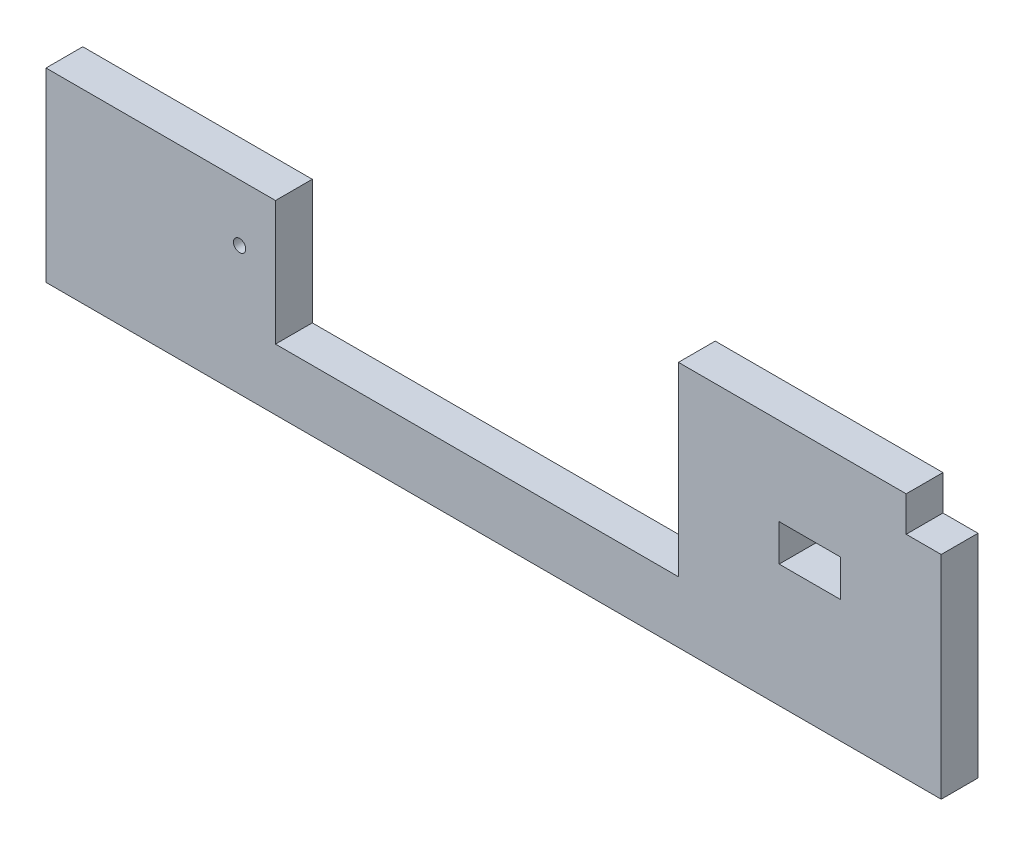
ISO-10303-21;
HEADER;
FILE_DESCRIPTION(('STEP AP214'),'2;1');
FILE_NAME('part.step','',(''),(''),'','','');
FILE_SCHEMA(('AUTOMOTIVE_DESIGN { 1 0 10303 214 1 1 1 1 }'));
ENDSEC;
DATA;
#1=APPLICATION_CONTEXT('core data for automotive mechanical design processes');
#2=APPLICATION_PROTOCOL_DEFINITION('international standard','automotive_design',2000,#1);
#3=PRODUCT_CONTEXT('',#1,'mechanical');
#4=PRODUCT('Part','Part','',(#3));
#5=PRODUCT_RELATED_PRODUCT_CATEGORY('part','',(#4));
#6=PRODUCT_DEFINITION_FORMATION('','',#4);
#7=PRODUCT_DEFINITION_CONTEXT('part definition',#1,'design');
#8=PRODUCT_DEFINITION('design','',#6,#7);
#9=PRODUCT_DEFINITION_SHAPE('','',#8);
#10=(LENGTH_UNIT() NAMED_UNIT(*) SI_UNIT(.MILLI.,.METRE.));
#11=(NAMED_UNIT(*) PLANE_ANGLE_UNIT() SI_UNIT($,.RADIAN.));
#12=(NAMED_UNIT(*) SI_UNIT($,.STERADIAN.) SOLID_ANGLE_UNIT());
#13=UNCERTAINTY_MEASURE_WITH_UNIT(LENGTH_MEASURE(1.E-05),#10,'distance_accuracy_value','');
#14=(GEOMETRIC_REPRESENTATION_CONTEXT(3) GLOBAL_UNCERTAINTY_ASSIGNED_CONTEXT((#13)) GLOBAL_UNIT_ASSIGNED_CONTEXT((#10,
#11,#12)) REPRESENTATION_CONTEXT('',''));
#15=CARTESIAN_POINT('',(0.,0.,0.));
#16=DIRECTION('',(0.,0.,1.));
#17=DIRECTION('',(1.,0.,0.));
#18=AXIS2_PLACEMENT_3D('',#15,#16,#17);
#19=CARTESIAN_POINT('',(-85.0624454176962,-35.0708196621493,5.334));
#20=DIRECTION('',(0.,-1.,0.));
#21=DIRECTION('',(0.,0.,-1.));
#22=AXIS2_PLACEMENT_3D('',#19,#20,#21);
#23=PLANE('',#22);
#24=DIRECTION('',(-1.,0.,0.));
#25=VECTOR('',#24,1.);
#26=CARTESIAN_POINT('',(-85.0624454176962,-35.0708196621493,5.334));
#27=LINE('',#26,#25);
#28=CARTESIAN_POINT('',(-51.7884454176962,-35.0708196621493,5.334));
#29=VERTEX_POINT('',#28);
#30=CARTESIAN_POINT('',(-85.0624454176962,-35.0708196621493,5.334));
#31=VERTEX_POINT('',#30);
#32=EDGE_CURVE('E45',#29,#31,#27,.T.);
#33=ORIENTED_EDGE('',*,*,#32,.F.);
#34=DIRECTION('',(0.,0.,1.));
#35=VECTOR('',#34,1.);
#36=CARTESIAN_POINT('',(-51.7884454176962,-35.0708196621493,0.));
#37=LINE('',#36,#35);
#38=CARTESIAN_POINT('',(-51.7884454176962,-35.0708196621493,0.));
#39=VERTEX_POINT('',#38);
#40=EDGE_CURVE('E147',#39,#29,#37,.T.);
#41=ORIENTED_EDGE('',*,*,#40,.F.);
#42=DIRECTION('',(-1.,0.,0.));
#43=VECTOR('',#42,1.);
#44=CARTESIAN_POINT('',(-85.0624454176962,-35.0708196621493,0.));
#45=LINE('',#44,#43);
#46=CARTESIAN_POINT('',(-85.0624454176962,-35.0708196621493,0.));
#47=VERTEX_POINT('',#46);
#48=EDGE_CURVE('E251',#39,#47,#45,.T.);
#49=ORIENTED_EDGE('',*,*,#48,.T.);
#50=DIRECTION('',(0.,0.,-1.));
#51=VECTOR('',#50,1.);
#52=CARTESIAN_POINT('',(-85.0624454176962,-35.0708196621493,5.334));
#53=LINE('',#52,#51);
#54=EDGE_CURVE('E11',#31,#47,#53,.T.);
#55=ORIENTED_EDGE('',*,*,#54,.F.);
#56=EDGE_LOOP('',(#33,#41,#49,#55));
#57=FACE_BOUND('',#56,.T.);
#58=ADVANCED_FACE('F37',(#57),#23,.F.);
#59=CARTESIAN_POINT('',(-85.0624454176962,-35.0708196621493,5.334));
#60=DIRECTION('',(1.,0.,0.));
#61=DIRECTION('',(0.,1.,0.));
#62=AXIS2_PLACEMENT_3D('',#59,#60,#61);
#63=PLANE('',#62);
#64=DIRECTION('',(0.,-1.,0.));
#65=VECTOR('',#64,1.);
#66=CARTESIAN_POINT('',(-85.0624454176962,-35.0708196621493,0.));
#67=LINE('',#66,#65);
#68=CARTESIAN_POINT('',(-85.0624454176962,-61.9948196621493,0.));
#69=VERTEX_POINT('',#68);
#70=EDGE_CURVE('E138',#47,#69,#67,.T.);
#71=ORIENTED_EDGE('',*,*,#70,.T.);
#72=DIRECTION('',(0.,0.,-1.));
#73=VECTOR('',#72,1.);
#74=CARTESIAN_POINT('',(-85.0624454176962,-61.9948196621493,5.334));
#75=LINE('',#74,#73);
#76=CARTESIAN_POINT('',(-85.0624454176962,-61.9948196621493,5.334));
#77=VERTEX_POINT('',#76);
#78=EDGE_CURVE('E142',#77,#69,#75,.T.);
#79=ORIENTED_EDGE('',*,*,#78,.F.);
#80=DIRECTION('',(0.,-1.,0.));
#81=VECTOR('',#80,1.);
#82=CARTESIAN_POINT('',(-85.0624454176962,-35.0708196621493,5.334));
#83=LINE('',#82,#81);
#84=EDGE_CURVE('E248',#31,#77,#83,.T.);
#85=ORIENTED_EDGE('',*,*,#84,.F.);
#86=ORIENTED_EDGE('',*,*,#54,.T.);
#87=EDGE_LOOP('',(#71,#79,#85,#86));
#88=FACE_BOUND('',#87,.T.);
#89=ADVANCED_FACE('F39',(#88),#63,.F.);
#90=CARTESIAN_POINT('',(44.7315545823038,-35.0708196621493,5.334));
#91=DIRECTION('',(-1.,0.,0.));
#92=DIRECTION('',(0.,-1.,0.));
#93=AXIS2_PLACEMENT_3D('',#90,#91,#92);
#94=PLANE('',#93);
#95=DIRECTION('',(0.,1.,0.));
#96=VECTOR('',#95,1.);
#97=CARTESIAN_POINT('',(44.7315545823038,-35.0708196621493,0.));
#98=LINE('',#97,#96);
#99=CARTESIAN_POINT('',(44.7315545823038,-61.9948196621493,0.));
#100=VERTEX_POINT('',#99);
#101=CARTESIAN_POINT('',(44.7315545823038,-31.2608196621493,0.));
#102=VERTEX_POINT('',#101);
#103=EDGE_CURVE('E146',#100,#102,#98,.T.);
#104=ORIENTED_EDGE('',*,*,#103,.T.);
#105=DIRECTION('',(0.,0.,1.));
#106=VECTOR('',#105,1.);
#107=CARTESIAN_POINT('',(44.7315545823038,-31.2608196621493,0.));
#108=LINE('',#107,#106);
#109=CARTESIAN_POINT('',(44.7315545823038,-31.2608196621493,5.334));
#110=VERTEX_POINT('',#109);
#111=EDGE_CURVE('E212',#102,#110,#108,.T.);
#112=ORIENTED_EDGE('',*,*,#111,.T.);
#113=DIRECTION('',(0.,1.,0.));
#114=VECTOR('',#113,1.);
#115=CARTESIAN_POINT('',(44.7315545823038,-35.0708196621493,5.334));
#116=LINE('',#115,#114);
#117=CARTESIAN_POINT('',(44.7315545823038,-61.9948196621493,5.334));
#118=VERTEX_POINT('',#117);
#119=EDGE_CURVE('E250',#118,#110,#116,.T.);
#120=ORIENTED_EDGE('',*,*,#119,.F.);
#121=DIRECTION('',(0.,0.,1.));
#122=VECTOR('',#121,1.);
#123=CARTESIAN_POINT('',(44.7315545823038,-61.9948196621493,5.334));
#124=LINE('',#123,#122);
#125=EDGE_CURVE('E158',#100,#118,#124,.T.);
#126=ORIENTED_EDGE('',*,*,#125,.F.);
#127=EDGE_LOOP('',(#104,#112,#120,#126));
#128=FACE_BOUND('',#127,.T.);
#129=ADVANCED_FACE('F285',(#128),#94,.F.);
#130=CARTESIAN_POINT('',(0.,0.,5.334));
#131=DIRECTION('',(0.,0.,1.));
#132=DIRECTION('',(1.,0.,0.));
#133=AXIS2_PLACEMENT_3D('',#130,#131,#132);
#134=PLANE('',#133);
#135=CARTESIAN_POINT('',(-56.9954454176962,-43.3258196621493,5.334));
#136=DIRECTION('',(0.,0.,1.));
#137=DIRECTION('',(1.,0.,0.));
#138=AXIS2_PLACEMENT_3D('',#135,#136,#137);
#139=CIRCLE('',#138,0.889000000000002);
#140=CARTESIAN_POINT('',(-56.1064454176962,-43.3258196621493,5.334));
#141=VERTEX_POINT('',#140);
#142=EDGE_CURVE('E168',#141,#141,#139,.T.);
#143=ORIENTED_EDGE('',*,*,#142,.F.);
#144=EDGE_LOOP('',(#143));
#145=FACE_BOUND('',#144,.T.);
#146=DIRECTION('',(0.,-1.,0.));
#147=VECTOR('',#146,1.);
#148=CARTESIAN_POINT('',(21.2365545823038,-38.8808196621493,5.334));
#149=LINE('',#148,#147);
#150=CARTESIAN_POINT('',(21.2365545823038,-38.8808196621493,5.334));
#151=VERTEX_POINT('',#150);
#152=CARTESIAN_POINT('',(21.2365545823038,-44.2148196621493,5.334));
#153=VERTEX_POINT('',#152);
#154=EDGE_CURVE('E52',#151,#153,#149,.T.);
#155=ORIENTED_EDGE('',*,*,#154,.F.);
#156=DIRECTION('',(-1.,0.,0.));
#157=VECTOR('',#156,1.);
#158=CARTESIAN_POINT('',(21.2365545823038,-38.8808196621493,5.334));
#159=LINE('',#158,#157);
#160=CARTESIAN_POINT('',(30.1265545823038,-38.8808196621493,5.334));
#161=VERTEX_POINT('',#160);
#162=EDGE_CURVE('E178',#161,#151,#159,.T.);
#163=ORIENTED_EDGE('',*,*,#162,.F.);
#164=DIRECTION('',(0.,1.,0.));
#165=VECTOR('',#164,1.);
#166=CARTESIAN_POINT('',(30.1265545823038,-38.8808196621493,5.334));
#167=LINE('',#166,#165);
#168=CARTESIAN_POINT('',(30.1265545823038,-44.2148196621493,5.334));
#169=VERTEX_POINT('',#168);
#170=EDGE_CURVE('E190',#169,#161,#167,.T.);
#171=ORIENTED_EDGE('',*,*,#170,.F.);
#172=DIRECTION('',(1.,0.,0.));
#173=VECTOR('',#172,1.);
#174=CARTESIAN_POINT('',(21.2365545823038,-44.2148196621493,5.334));
#175=LINE('',#174,#173);
#176=EDGE_CURVE('E187',#153,#169,#175,.T.);
#177=ORIENTED_EDGE('',*,*,#176,.F.);
#178=EDGE_LOOP('',(#155,#163,#171,#177));
#179=FACE_BOUND('',#178,.T.);
#180=DIRECTION('',(1.,0.,0.));
#181=VECTOR('',#180,1.);
#182=CARTESIAN_POINT('',(44.7315545823038,-31.2608196621493,5.334));
#183=LINE('',#182,#181);
#184=CARTESIAN_POINT('',(39.6515545823038,-31.2608196621493,5.334));
#185=VERTEX_POINT('',#184);
#186=EDGE_CURVE('E206',#185,#110,#183,.T.);
#187=ORIENTED_EDGE('',*,*,#186,.F.);
#188=DIRECTION('',(0.,-1.,0.));
#189=VECTOR('',#188,1.);
#190=CARTESIAN_POINT('',(39.6515545823038,-26.1808196621493,5.334));
#191=LINE('',#190,#189);
#192=CARTESIAN_POINT('',(39.6515545823038,-26.1808196621493,5.334));
#193=VERTEX_POINT('',#192);
#194=EDGE_CURVE('E197',#193,#185,#191,.T.);
#195=ORIENTED_EDGE('',*,*,#194,.F.);
#196=DIRECTION('',(1.,0.,0.));
#197=VECTOR('',#196,1.);
#198=CARTESIAN_POINT('',(6.63155458230381,-26.1808196621493,5.334));
#199=LINE('',#198,#197);
#200=CARTESIAN_POINT('',(6.63155458230381,-26.1808196621493,5.334));
#201=VERTEX_POINT('',#200);
#202=EDGE_CURVE('E221',#201,#193,#199,.T.);
#203=ORIENTED_EDGE('',*,*,#202,.F.);
#204=DIRECTION('',(0.,1.,0.));
#205=VECTOR('',#204,1.);
#206=CARTESIAN_POINT('',(6.63155458230381,-35.0708196621493,5.334));
#207=LINE('',#206,#205);
#208=CARTESIAN_POINT('',(6.63155458230381,-53.1048196621493,5.334));
#209=VERTEX_POINT('',#208);
#210=EDGE_CURVE('E231',#209,#201,#207,.T.);
#211=ORIENTED_EDGE('',*,*,#210,.F.);
#212=DIRECTION('',(1.,0.,0.));
#213=VECTOR('',#212,1.);
#214=CARTESIAN_POINT('',(-51.7884454176962,-53.1048196621493,5.334));
#215=LINE('',#214,#213);
#216=CARTESIAN_POINT('',(-51.7884454176962,-53.1048196621493,5.334));
#217=VERTEX_POINT('',#216);
#218=EDGE_CURVE('E240',#217,#209,#215,.T.);
#219=ORIENTED_EDGE('',*,*,#218,.F.);
#220=DIRECTION('',(0.,-1.,0.));
#221=VECTOR('',#220,1.);
#222=CARTESIAN_POINT('',(-51.7884454176962,-35.0708196621493,5.334));
#223=LINE('',#222,#221);
#224=EDGE_CURVE('E226',#29,#217,#223,.T.);
#225=ORIENTED_EDGE('',*,*,#224,.F.);
#226=ORIENTED_EDGE('',*,*,#32,.T.);
#227=ORIENTED_EDGE('',*,*,#84,.T.);
#228=DIRECTION('',(-1.,0.,0.));
#229=VECTOR('',#228,1.);
#230=CARTESIAN_POINT('',(-85.0624454176962,-61.9948196621493,5.334));
#231=LINE('',#230,#229);
#232=EDGE_CURVE('E163',#118,#77,#231,.T.);
#233=ORIENTED_EDGE('',*,*,#232,.F.);
#234=ORIENTED_EDGE('',*,*,#119,.T.);
#235=EDGE_LOOP('',(#187,#195,#203,#211,#219,#225,#226,#227,#233,#234));
#236=FACE_BOUND('',#235,.T.);
#237=ADVANCED_FACE('F280',(#145,#179,#236),#134,.T.);
#238=CARTESIAN_POINT('',(0.,0.,0.));
#239=DIRECTION('',(0.,0.,1.));
#240=DIRECTION('',(1.,0.,0.));
#241=AXIS2_PLACEMENT_3D('',#238,#239,#240);
#242=PLANE('',#241);
#243=CARTESIAN_POINT('',(-56.9954454176962,-43.3258196621493,0.));
#244=DIRECTION('',(0.,0.,1.));
#245=DIRECTION('',(1.,0.,0.));
#246=AXIS2_PLACEMENT_3D('',#243,#244,#245);
#247=CIRCLE('',#246,0.889000000000002);
#248=CARTESIAN_POINT('',(-56.1064454176962,-43.3258196621493,0.));
#249=VERTEX_POINT('',#248);
#250=EDGE_CURVE('E169',#249,#249,#247,.T.);
#251=ORIENTED_EDGE('',*,*,#250,.T.);
#252=EDGE_LOOP('',(#251));
#253=FACE_BOUND('',#252,.T.);
#254=DIRECTION('',(-1.,0.,0.));
#255=VECTOR('',#254,1.);
#256=CARTESIAN_POINT('',(21.2365545823038,-38.8808196621493,0.));
#257=LINE('',#256,#255);
#258=CARTESIAN_POINT('',(30.1265545823038,-38.8808196621493,0.));
#259=VERTEX_POINT('',#258);
#260=CARTESIAN_POINT('',(21.2365545823038,-38.8808196621493,0.));
#261=VERTEX_POINT('',#260);
#262=EDGE_CURVE('E182',#259,#261,#257,.T.);
#263=ORIENTED_EDGE('',*,*,#262,.T.);
#264=DIRECTION('',(0.,-1.,0.));
#265=VECTOR('',#264,1.);
#266=CARTESIAN_POINT('',(21.2365545823038,-38.8808196621493,0.));
#267=LINE('',#266,#265);
#268=CARTESIAN_POINT('',(21.2365545823038,-44.2148196621493,0.));
#269=VERTEX_POINT('',#268);
#270=EDGE_CURVE('E174',#261,#269,#267,.T.);
#271=ORIENTED_EDGE('',*,*,#270,.T.);
#272=DIRECTION('',(1.,0.,0.));
#273=VECTOR('',#272,1.);
#274=CARTESIAN_POINT('',(21.2365545823038,-44.2148196621493,0.));
#275=LINE('',#274,#273);
#276=CARTESIAN_POINT('',(30.1265545823038,-44.2148196621493,0.));
#277=VERTEX_POINT('',#276);
#278=EDGE_CURVE('E177',#269,#277,#275,.T.);
#279=ORIENTED_EDGE('',*,*,#278,.T.);
#280=DIRECTION('',(0.,1.,0.));
#281=VECTOR('',#280,1.);
#282=CARTESIAN_POINT('',(30.1265545823038,-38.8808196621493,0.));
#283=LINE('',#282,#281);
#284=EDGE_CURVE('E60',#277,#259,#283,.T.);
#285=ORIENTED_EDGE('',*,*,#284,.T.);
#286=EDGE_LOOP('',(#263,#271,#279,#285));
#287=FACE_BOUND('',#286,.T.);
#288=DIRECTION('',(0.,-1.,0.));
#289=VECTOR('',#288,1.);
#290=CARTESIAN_POINT('',(39.6515545823038,-26.1808196621493,0.));
#291=LINE('',#290,#289);
#292=CARTESIAN_POINT('',(39.6515545823038,-26.1808196621493,0.));
#293=VERTEX_POINT('',#292);
#294=CARTESIAN_POINT('',(39.6515545823038,-31.2608196621493,0.));
#295=VERTEX_POINT('',#294);
#296=EDGE_CURVE('E203',#293,#295,#291,.T.);
#297=ORIENTED_EDGE('',*,*,#296,.T.);
#298=DIRECTION('',(1.,0.,0.));
#299=VECTOR('',#298,1.);
#300=CARTESIAN_POINT('',(44.7315545823038,-31.2608196621493,0.));
#301=LINE('',#300,#299);
#302=EDGE_CURVE('E205',#295,#102,#301,.T.);
#303=ORIENTED_EDGE('',*,*,#302,.T.);
#304=ORIENTED_EDGE('',*,*,#103,.F.);
#305=DIRECTION('',(1.,0.,0.));
#306=VECTOR('',#305,1.);
#307=CARTESIAN_POINT('',(-85.0624454176962,-61.9948196621493,0.));
#308=LINE('',#307,#306);
#309=EDGE_CURVE('E150',#69,#100,#308,.T.);
#310=ORIENTED_EDGE('',*,*,#309,.F.);
#311=ORIENTED_EDGE('',*,*,#70,.F.);
#312=ORIENTED_EDGE('',*,*,#48,.F.);
#313=DIRECTION('',(0.,-1.,0.));
#314=VECTOR('',#313,1.);
#315=CARTESIAN_POINT('',(-51.7884454176962,-35.0708196621493,0.));
#316=LINE('',#315,#314);
#317=CARTESIAN_POINT('',(-51.7884454176962,-53.1048196621493,0.));
#318=VERTEX_POINT('',#317);
#319=EDGE_CURVE('E227',#39,#318,#316,.T.);
#320=ORIENTED_EDGE('',*,*,#319,.T.);
#321=DIRECTION('',(1.,0.,0.));
#322=VECTOR('',#321,1.);
#323=CARTESIAN_POINT('',(-51.7884454176962,-53.1048196621493,0.));
#324=LINE('',#323,#322);
#325=CARTESIAN_POINT('',(6.63155458230381,-53.1048196621493,0.));
#326=VERTEX_POINT('',#325);
#327=EDGE_CURVE('E230',#318,#326,#324,.T.);
#328=ORIENTED_EDGE('',*,*,#327,.T.);
#329=DIRECTION('',(0.,1.,0.));
#330=VECTOR('',#329,1.);
#331=CARTESIAN_POINT('',(6.63155458230381,-35.0708196621493,0.));
#332=LINE('',#331,#330);
#333=CARTESIAN_POINT('',(6.63155458230381,-26.1808196621493,0.));
#334=VERTEX_POINT('',#333);
#335=EDGE_CURVE('E234',#326,#334,#332,.T.);
#336=ORIENTED_EDGE('',*,*,#335,.T.);
#337=DIRECTION('',(-1.,0.,0.));
#338=VECTOR('',#337,1.);
#339=CARTESIAN_POINT('',(6.63155458230381,-26.1808196621493,0.));
#340=LINE('',#339,#338);
#341=EDGE_CURVE('E224',#293,#334,#340,.T.);
#342=ORIENTED_EDGE('',*,*,#341,.F.);
#343=EDGE_LOOP('',(#297,#303,#304,#310,#311,#312,#320,#328,#336,#342));
#344=FACE_BOUND('',#343,.T.);
#345=ADVANCED_FACE('F152',(#253,#287,#344),#242,.F.);
#346=CARTESIAN_POINT('',(-51.7884454176962,-35.0708196621493,0.));
#347=DIRECTION('',(-1.,0.,0.));
#348=DIRECTION('',(0.,-1.,0.));
#349=AXIS2_PLACEMENT_3D('',#346,#347,#348);
#350=PLANE('',#349);
#351=ORIENTED_EDGE('',*,*,#224,.T.);
#352=DIRECTION('',(0.,0.,1.));
#353=VECTOR('',#352,1.);
#354=CARTESIAN_POINT('',(-51.7884454176962,-53.1048196621493,0.));
#355=LINE('',#354,#353);
#356=EDGE_CURVE('E237',#318,#217,#355,.T.);
#357=ORIENTED_EDGE('',*,*,#356,.F.);
#358=ORIENTED_EDGE('',*,*,#319,.F.);
#359=ORIENTED_EDGE('',*,*,#40,.T.);
#360=EDGE_LOOP('',(#351,#357,#358,#359));
#361=FACE_BOUND('',#360,.T.);
#362=ADVANCED_FACE('F260',(#361),#350,.F.);
#363=CARTESIAN_POINT('',(6.63155458230381,-35.0708196621493,0.));
#364=DIRECTION('',(1.,0.,0.));
#365=DIRECTION('',(0.,1.,0.));
#366=AXIS2_PLACEMENT_3D('',#363,#364,#365);
#367=PLANE('',#366);
#368=ORIENTED_EDGE('',*,*,#210,.T.);
#369=DIRECTION('',(0.,0.,1.));
#370=VECTOR('',#369,1.);
#371=CARTESIAN_POINT('',(6.63155458230381,-26.1808196621493,0.));
#372=LINE('',#371,#370);
#373=EDGE_CURVE('E215',#334,#201,#372,.T.);
#374=ORIENTED_EDGE('',*,*,#373,.F.);
#375=ORIENTED_EDGE('',*,*,#335,.F.);
#376=DIRECTION('',(0.,0.,1.));
#377=VECTOR('',#376,1.);
#378=CARTESIAN_POINT('',(6.63155458230381,-53.1048196621493,0.));
#379=LINE('',#378,#377);
#380=EDGE_CURVE('E245',#326,#209,#379,.T.);
#381=ORIENTED_EDGE('',*,*,#380,.T.);
#382=EDGE_LOOP('',(#368,#374,#375,#381));
#383=FACE_BOUND('',#382,.T.);
#384=ADVANCED_FACE('F268',(#383),#367,.F.);
#385=CARTESIAN_POINT('',(-51.7884454176962,-53.1048196621493,0.));
#386=DIRECTION('',(0.,-1.,0.));
#387=DIRECTION('',(0.,0.,-1.));
#388=AXIS2_PLACEMENT_3D('',#385,#386,#387);
#389=PLANE('',#388);
#390=ORIENTED_EDGE('',*,*,#218,.T.);
#391=ORIENTED_EDGE('',*,*,#380,.F.);
#392=ORIENTED_EDGE('',*,*,#327,.F.);
#393=ORIENTED_EDGE('',*,*,#356,.T.);
#394=EDGE_LOOP('',(#390,#391,#392,#393));
#395=FACE_BOUND('',#394,.T.);
#396=ADVANCED_FACE('F265',(#395),#389,.F.);
#397=CARTESIAN_POINT('',(0.,-26.1808196621493,0.));
#398=DIRECTION('',(0.,1.,0.));
#399=DIRECTION('',(0.,0.,1.));
#400=AXIS2_PLACEMENT_3D('',#397,#398,#399);
#401=PLANE('',#400);
#402=DIRECTION('',(0.,0.,1.));
#403=VECTOR('',#402,1.);
#404=CARTESIAN_POINT('',(39.6515545823038,-26.1808196621493,0.));
#405=LINE('',#404,#403);
#406=EDGE_CURVE('E208',#293,#193,#405,.T.);
#407=ORIENTED_EDGE('',*,*,#406,.F.);
#408=ORIENTED_EDGE('',*,*,#341,.T.);
#409=ORIENTED_EDGE('',*,*,#373,.T.);
#410=ORIENTED_EDGE('',*,*,#202,.T.);
#411=EDGE_LOOP('',(#407,#408,#409,#410));
#412=FACE_BOUND('',#411,.T.);
#413=ADVANCED_FACE('F274',(#412),#401,.T.);
#414=CARTESIAN_POINT('',(44.7315545823038,-31.2608196621493,0.));
#415=DIRECTION('',(0.,-1.,0.));
#416=DIRECTION('',(0.,0.,-1.));
#417=AXIS2_PLACEMENT_3D('',#414,#415,#416);
#418=PLANE('',#417);
#419=ORIENTED_EDGE('',*,*,#186,.T.);
#420=ORIENTED_EDGE('',*,*,#111,.F.);
#421=ORIENTED_EDGE('',*,*,#302,.F.);
#422=DIRECTION('',(0.,0.,1.));
#423=VECTOR('',#422,1.);
#424=CARTESIAN_POINT('',(39.6515545823038,-31.2608196621493,0.));
#425=LINE('',#424,#423);
#426=EDGE_CURVE('E216',#295,#185,#425,.T.);
#427=ORIENTED_EDGE('',*,*,#426,.T.);
#428=EDGE_LOOP('',(#419,#420,#421,#427));
#429=FACE_BOUND('',#428,.T.);
#430=ADVANCED_FACE('F282',(#429),#418,.F.);
#431=CARTESIAN_POINT('',(39.6515545823038,-26.1808196621493,0.));
#432=DIRECTION('',(-1.,0.,0.));
#433=DIRECTION('',(0.,0.,1.));
#434=AXIS2_PLACEMENT_3D('',#431,#432,#433);
#435=PLANE('',#434);
#436=ORIENTED_EDGE('',*,*,#194,.T.);
#437=ORIENTED_EDGE('',*,*,#426,.F.);
#438=ORIENTED_EDGE('',*,*,#296,.F.);
#439=ORIENTED_EDGE('',*,*,#406,.T.);
#440=EDGE_LOOP('',(#436,#437,#438,#439));
#441=FACE_BOUND('',#440,.T.);
#442=ADVANCED_FACE('F277',(#441),#435,.F.);
#443=CARTESIAN_POINT('',(21.2365545823038,-38.8808196621493,0.));
#444=DIRECTION('',(-1.,0.,0.));
#445=DIRECTION('',(0.,-1.,0.));
#446=AXIS2_PLACEMENT_3D('',#443,#444,#445);
#447=PLANE('',#446);
#448=ORIENTED_EDGE('',*,*,#154,.T.);
#449=DIRECTION('',(0.,0.,1.));
#450=VECTOR('',#449,1.);
#451=CARTESIAN_POINT('',(21.2365545823038,-44.2148196621493,0.));
#452=LINE('',#451,#450);
#453=EDGE_CURVE('E185',#269,#153,#452,.T.);
#454=ORIENTED_EDGE('',*,*,#453,.F.);
#455=ORIENTED_EDGE('',*,*,#270,.F.);
#456=DIRECTION('',(0.,0.,1.));
#457=VECTOR('',#456,1.);
#458=CARTESIAN_POINT('',(21.2365545823038,-38.8808196621493,0.));
#459=LINE('',#458,#457);
#460=EDGE_CURVE('E195',#261,#151,#459,.T.);
#461=ORIENTED_EDGE('',*,*,#460,.T.);
#462=EDGE_LOOP('',(#448,#454,#455,#461));
#463=FACE_BOUND('',#462,.T.);
#464=ADVANCED_FACE('F311',(#463),#447,.F.);
#465=CARTESIAN_POINT('',(21.2365545823038,-38.8808196621493,0.));
#466=DIRECTION('',(0.,1.,0.));
#467=DIRECTION('',(-1.,0.,0.));
#468=AXIS2_PLACEMENT_3D('',#465,#466,#467);
#469=PLANE('',#468);
#470=ORIENTED_EDGE('',*,*,#162,.T.);
#471=ORIENTED_EDGE('',*,*,#460,.F.);
#472=ORIENTED_EDGE('',*,*,#262,.F.);
#473=DIRECTION('',(0.,0.,1.));
#474=VECTOR('',#473,1.);
#475=CARTESIAN_POINT('',(30.1265545823038,-38.8808196621493,0.));
#476=LINE('',#475,#474);
#477=EDGE_CURVE('E198',#259,#161,#476,.T.);
#478=ORIENTED_EDGE('',*,*,#477,.T.);
#479=EDGE_LOOP('',(#470,#471,#472,#478));
#480=FACE_BOUND('',#479,.T.);
#481=ADVANCED_FACE('F316',(#480),#469,.F.);
#482=CARTESIAN_POINT('',(30.1265545823038,-38.8808196621493,0.));
#483=DIRECTION('',(1.,0.,0.));
#484=DIRECTION('',(0.,1.,0.));
#485=AXIS2_PLACEMENT_3D('',#482,#483,#484);
#486=PLANE('',#485);
#487=ORIENTED_EDGE('',*,*,#170,.T.);
#488=ORIENTED_EDGE('',*,*,#477,.F.);
#489=ORIENTED_EDGE('',*,*,#284,.F.);
#490=DIRECTION('',(0.,0.,1.));
#491=VECTOR('',#490,1.);
#492=CARTESIAN_POINT('',(30.1265545823038,-44.2148196621493,0.));
#493=LINE('',#492,#491);
#494=EDGE_CURVE('E200',#277,#169,#493,.T.);
#495=ORIENTED_EDGE('',*,*,#494,.T.);
#496=EDGE_LOOP('',(#487,#488,#489,#495));
#497=FACE_BOUND('',#496,.T.);
#498=ADVANCED_FACE('F321',(#497),#486,.F.);
#499=CARTESIAN_POINT('',(21.2365545823038,-44.2148196621493,0.));
#500=DIRECTION('',(0.,-1.,0.));
#501=DIRECTION('',(0.,0.,-1.));
#502=AXIS2_PLACEMENT_3D('',#499,#500,#501);
#503=PLANE('',#502);
#504=ORIENTED_EDGE('',*,*,#176,.T.);
#505=ORIENTED_EDGE('',*,*,#494,.F.);
#506=ORIENTED_EDGE('',*,*,#278,.F.);
#507=ORIENTED_EDGE('',*,*,#453,.T.);
#508=EDGE_LOOP('',(#504,#505,#506,#507));
#509=FACE_BOUND('',#508,.T.);
#510=ADVANCED_FACE('F317',(#509),#503,.F.);
#511=CARTESIAN_POINT('',(-56.9954454176962,-43.3258196621493,0.));
#512=DIRECTION('',(0.,0.,1.));
#513=DIRECTION('',(1.,0.,0.));
#514=AXIS2_PLACEMENT_3D('',#511,#512,#513);
#515=CYLINDRICAL_SURFACE('',#514,0.889000000000002);
#516=ORIENTED_EDGE('',*,*,#250,.F.);
#517=EDGE_LOOP('',(#516));
#518=FACE_BOUND('',#517,.T.);
#519=ORIENTED_EDGE('',*,*,#142,.T.);
#520=EDGE_LOOP('',(#519));
#521=FACE_BOUND('',#520,.T.);
#522=ADVANCED_FACE('F320',(#518,#521),#515,.F.);
#523=CARTESIAN_POINT('',(0.,-61.9948196621493,0.));
#524=DIRECTION('',(0.,-1.,0.));
#525=DIRECTION('',(0.,0.,-1.));
#526=AXIS2_PLACEMENT_3D('',#523,#524,#525);
#527=PLANE('',#526);
#528=ORIENTED_EDGE('',*,*,#78,.T.);
#529=ORIENTED_EDGE('',*,*,#309,.T.);
#530=ORIENTED_EDGE('',*,*,#125,.T.);
#531=ORIENTED_EDGE('',*,*,#232,.T.);
#532=EDGE_LOOP('',(#528,#529,#530,#531));
#533=FACE_BOUND('',#532,.T.);
#534=ADVANCED_FACE('F161',(#533),#527,.T.);
#535=CLOSED_SHELL('',(#58,#89,#129,#237,#345,#362,#384,#396,#413,#430,#442,#464,#481,#498,#510,
#522,#534));
#536=MANIFOLD_SOLID_BREP('B2',#535);
#537=ADVANCED_BREP_SHAPE_REPRESENTATION('',(#18,#536),#14);
#538=SHAPE_DEFINITION_REPRESENTATION(#9,#537);
ENDSEC;
END-ISO-10303-21;
